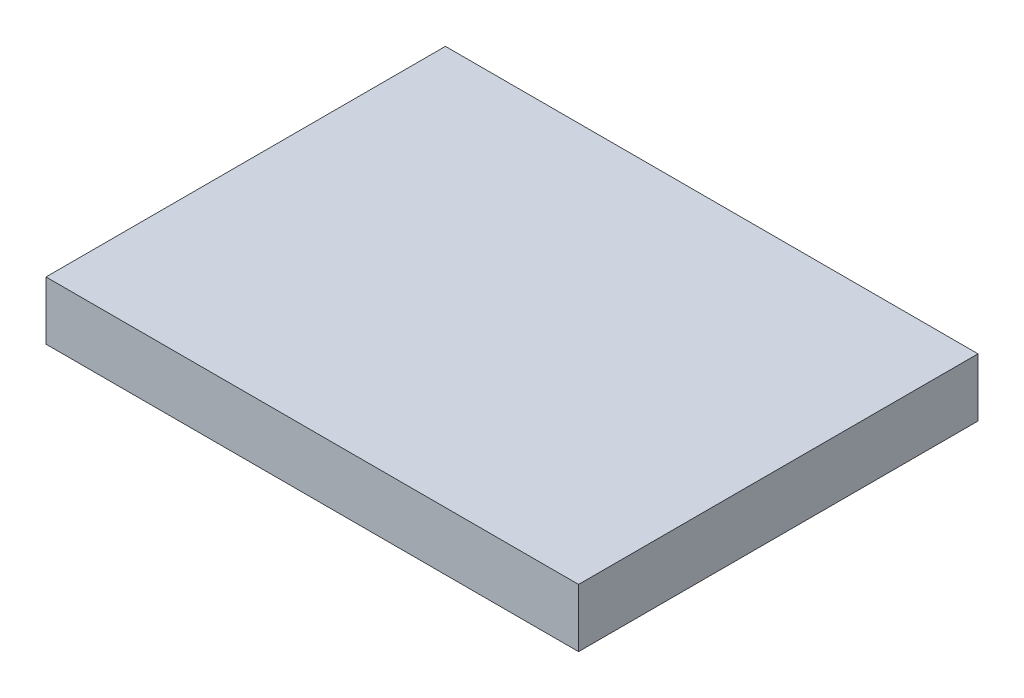
ISO-10303-21;
HEADER;
FILE_DESCRIPTION(('STEP AP214'),'2;1');
FILE_NAME('part.step','',(''),(''),'','','');
FILE_SCHEMA(('AUTOMOTIVE_DESIGN { 1 0 10303 214 1 1 1 1 }'));
ENDSEC;
DATA;
#1=APPLICATION_CONTEXT('core data for automotive mechanical design processes');
#2=APPLICATION_PROTOCOL_DEFINITION('international standard','automotive_design',2000,#1);
#3=PRODUCT_CONTEXT('',#1,'mechanical');
#4=PRODUCT('Part','Part','',(#3));
#5=PRODUCT_RELATED_PRODUCT_CATEGORY('part','',(#4));
#6=PRODUCT_DEFINITION_FORMATION('','',#4);
#7=PRODUCT_DEFINITION_CONTEXT('part definition',#1,'design');
#8=PRODUCT_DEFINITION('design','',#6,#7);
#9=PRODUCT_DEFINITION_SHAPE('','',#8);
#10=(LENGTH_UNIT() NAMED_UNIT(*) SI_UNIT(.MILLI.,.METRE.));
#11=(NAMED_UNIT(*) PLANE_ANGLE_UNIT() SI_UNIT($,.RADIAN.));
#12=(NAMED_UNIT(*) SI_UNIT($,.STERADIAN.) SOLID_ANGLE_UNIT());
#13=UNCERTAINTY_MEASURE_WITH_UNIT(LENGTH_MEASURE(1.E-05),#10,'distance_accuracy_value','');
#14=(GEOMETRIC_REPRESENTATION_CONTEXT(3) GLOBAL_UNCERTAINTY_ASSIGNED_CONTEXT((#13)) GLOBAL_UNIT_ASSIGNED_CONTEXT((#10,
#11,#12)) REPRESENTATION_CONTEXT('',''));
#15=CARTESIAN_POINT('',(0.,0.,0.));
#16=DIRECTION('',(0.,0.,1.));
#17=DIRECTION('',(1.,0.,0.));
#18=AXIS2_PLACEMENT_3D('',#15,#16,#17);
#19=CARTESIAN_POINT('',(-45.72,10.,34.29));
#20=DIRECTION('',(1.,0.,0.));
#21=DIRECTION('',(0.,0.,-1.));
#22=AXIS2_PLACEMENT_3D('',#19,#20,#21);
#23=PLANE('',#22);
#24=DIRECTION('',(0.,0.,1.));
#25=VECTOR('',#24,1.);
#26=CARTESIAN_POINT('',(-45.72,0.,34.29));
#27=LINE('',#26,#25);
#28=CARTESIAN_POINT('',(-45.72,0.,-34.29));
#29=VERTEX_POINT('',#28);
#30=CARTESIAN_POINT('',(-45.72,0.,34.29));
#31=VERTEX_POINT('',#30);
#32=EDGE_CURVE('E96',#29,#31,#27,.T.);
#33=ORIENTED_EDGE('',*,*,#32,.T.);
#34=DIRECTION('',(0.,-1.,0.));
#35=VECTOR('',#34,1.);
#36=CARTESIAN_POINT('',(-45.72,10.,34.29));
#37=LINE('',#36,#35);
#38=CARTESIAN_POINT('',(-45.72,10.,34.29));
#39=VERTEX_POINT('',#38);
#40=EDGE_CURVE('E11',#39,#31,#37,.T.);
#41=ORIENTED_EDGE('',*,*,#40,.F.);
#42=DIRECTION('',(0.,0.,1.));
#43=VECTOR('',#42,1.);
#44=CARTESIAN_POINT('',(-45.72,10.,34.29));
#45=LINE('',#44,#43);
#46=CARTESIAN_POINT('',(-45.72,10.,-34.29));
#47=VERTEX_POINT('',#46);
#48=EDGE_CURVE('E84',#47,#39,#45,.T.);
#49=ORIENTED_EDGE('',*,*,#48,.F.);
#50=DIRECTION('',(0.,-1.,0.));
#51=VECTOR('',#50,1.);
#52=CARTESIAN_POINT('',(-45.72,10.,-34.29));
#53=LINE('',#52,#51);
#54=EDGE_CURVE('E92',#47,#29,#53,.T.);
#55=ORIENTED_EDGE('',*,*,#54,.T.);
#56=EDGE_LOOP('',(#33,#41,#49,#55));
#57=FACE_BOUND('',#56,.T.);
#58=ADVANCED_FACE('F33',(#57),#23,.F.);
#59=CARTESIAN_POINT('',(45.72,10.,34.29));
#60=DIRECTION('',(0.,0.,-1.));
#61=DIRECTION('',(-1.,0.,0.));
#62=AXIS2_PLACEMENT_3D('',#59,#60,#61);
#63=PLANE('',#62);
#64=DIRECTION('',(1.,0.,0.));
#65=VECTOR('',#64,1.);
#66=CARTESIAN_POINT('',(45.72,0.,34.29));
#67=LINE('',#66,#65);
#68=CARTESIAN_POINT('',(45.72,0.,34.29));
#69=VERTEX_POINT('',#68);
#70=EDGE_CURVE('E88',#31,#69,#67,.T.);
#71=ORIENTED_EDGE('',*,*,#70,.T.);
#72=DIRECTION('',(0.,-1.,0.));
#73=VECTOR('',#72,1.);
#74=CARTESIAN_POINT('',(45.72,10.,34.29));
#75=LINE('',#74,#73);
#76=CARTESIAN_POINT('',(45.72,10.,34.29));
#77=VERTEX_POINT('',#76);
#78=EDGE_CURVE('E41',#77,#69,#75,.T.);
#79=ORIENTED_EDGE('',*,*,#78,.F.);
#80=DIRECTION('',(1.,0.,0.));
#81=VECTOR('',#80,1.);
#82=CARTESIAN_POINT('',(45.72,10.,34.29));
#83=LINE('',#82,#81);
#84=EDGE_CURVE('E79',#39,#77,#83,.T.);
#85=ORIENTED_EDGE('',*,*,#84,.F.);
#86=ORIENTED_EDGE('',*,*,#40,.T.);
#87=EDGE_LOOP('',(#71,#79,#85,#86));
#88=FACE_BOUND('',#87,.T.);
#89=ADVANCED_FACE('F87',(#88),#63,.F.);
#90=CARTESIAN_POINT('',(45.72,10.,34.29));
#91=DIRECTION('',(-1.,0.,0.));
#92=DIRECTION('',(0.,0.,1.));
#93=AXIS2_PLACEMENT_3D('',#90,#91,#92);
#94=PLANE('',#93);
#95=DIRECTION('',(0.,0.,-1.));
#96=VECTOR('',#95,1.);
#97=CARTESIAN_POINT('',(45.72,0.,34.29));
#98=LINE('',#97,#96);
#99=CARTESIAN_POINT('',(45.72,0.,-34.29));
#100=VERTEX_POINT('',#99);
#101=EDGE_CURVE('E66',#69,#100,#98,.T.);
#102=ORIENTED_EDGE('',*,*,#101,.T.);
#103=DIRECTION('',(0.,-1.,0.));
#104=VECTOR('',#103,1.);
#105=CARTESIAN_POINT('',(45.72,10.,-34.29));
#106=LINE('',#105,#104);
#107=CARTESIAN_POINT('',(45.72,10.,-34.29));
#108=VERTEX_POINT('',#107);
#109=EDGE_CURVE('E89',#108,#100,#106,.T.);
#110=ORIENTED_EDGE('',*,*,#109,.F.);
#111=DIRECTION('',(0.,0.,-1.));
#112=VECTOR('',#111,1.);
#113=CARTESIAN_POINT('',(45.72,10.,34.29));
#114=LINE('',#113,#112);
#115=EDGE_CURVE('E82',#77,#108,#114,.T.);
#116=ORIENTED_EDGE('',*,*,#115,.F.);
#117=ORIENTED_EDGE('',*,*,#78,.T.);
#118=EDGE_LOOP('',(#102,#110,#116,#117));
#119=FACE_BOUND('',#118,.T.);
#120=ADVANCED_FACE('F90',(#119),#94,.F.);
#121=CARTESIAN_POINT('',(45.72,10.,-34.29));
#122=DIRECTION('',(0.,0.,1.));
#123=DIRECTION('',(1.,0.,0.));
#124=AXIS2_PLACEMENT_3D('',#121,#122,#123);
#125=PLANE('',#124);
#126=DIRECTION('',(-1.,0.,0.));
#127=VECTOR('',#126,1.);
#128=CARTESIAN_POINT('',(45.72,0.,-34.29));
#129=LINE('',#128,#127);
#130=EDGE_CURVE('E72',#100,#29,#129,.T.);
#131=ORIENTED_EDGE('',*,*,#130,.T.);
#132=ORIENTED_EDGE('',*,*,#54,.F.);
#133=DIRECTION('',(-1.,0.,0.));
#134=VECTOR('',#133,1.);
#135=CARTESIAN_POINT('',(45.72,10.,-34.29));
#136=LINE('',#135,#134);
#137=EDGE_CURVE('E49',#108,#47,#136,.T.);
#138=ORIENTED_EDGE('',*,*,#137,.F.);
#139=ORIENTED_EDGE('',*,*,#109,.T.);
#140=EDGE_LOOP('',(#131,#132,#138,#139));
#141=FACE_BOUND('',#140,.T.);
#142=ADVANCED_FACE('F103',(#141),#125,.F.);
#143=CARTESIAN_POINT('',(0.,10.,0.));
#144=DIRECTION('',(0.,1.,0.));
#145=DIRECTION('',(0.,0.,1.));
#146=AXIS2_PLACEMENT_3D('',#143,#144,#145);
#147=PLANE('',#146);
#148=ORIENTED_EDGE('',*,*,#48,.T.);
#149=ORIENTED_EDGE('',*,*,#84,.T.);
#150=ORIENTED_EDGE('',*,*,#115,.T.);
#151=ORIENTED_EDGE('',*,*,#137,.T.);
#152=EDGE_LOOP('',(#148,#149,#150,#151));
#153=FACE_BOUND('',#152,.T.);
#154=ADVANCED_FACE('F80',(#153),#147,.T.);
#155=CARTESIAN_POINT('',(0.,0.,0.));
#156=DIRECTION('',(0.,1.,0.));
#157=DIRECTION('',(0.,0.,1.));
#158=AXIS2_PLACEMENT_3D('',#155,#156,#157);
#159=PLANE('',#158);
#160=ORIENTED_EDGE('',*,*,#32,.F.);
#161=ORIENTED_EDGE('',*,*,#130,.F.);
#162=ORIENTED_EDGE('',*,*,#101,.F.);
#163=ORIENTED_EDGE('',*,*,#70,.F.);
#164=EDGE_LOOP('',(#160,#161,#162,#163));
#165=FACE_BOUND('',#164,.T.);
#166=ADVANCED_FACE('F106',(#165),#159,.F.);
#167=CLOSED_SHELL('',(#58,#89,#120,#142,#154,#166));
#168=MANIFOLD_SOLID_BREP('B2',#167);
#169=ADVANCED_BREP_SHAPE_REPRESENTATION('',(#18,#168),#14);
#170=SHAPE_DEFINITION_REPRESENTATION(#9,#169);
ENDSEC;
END-ISO-10303-21;
